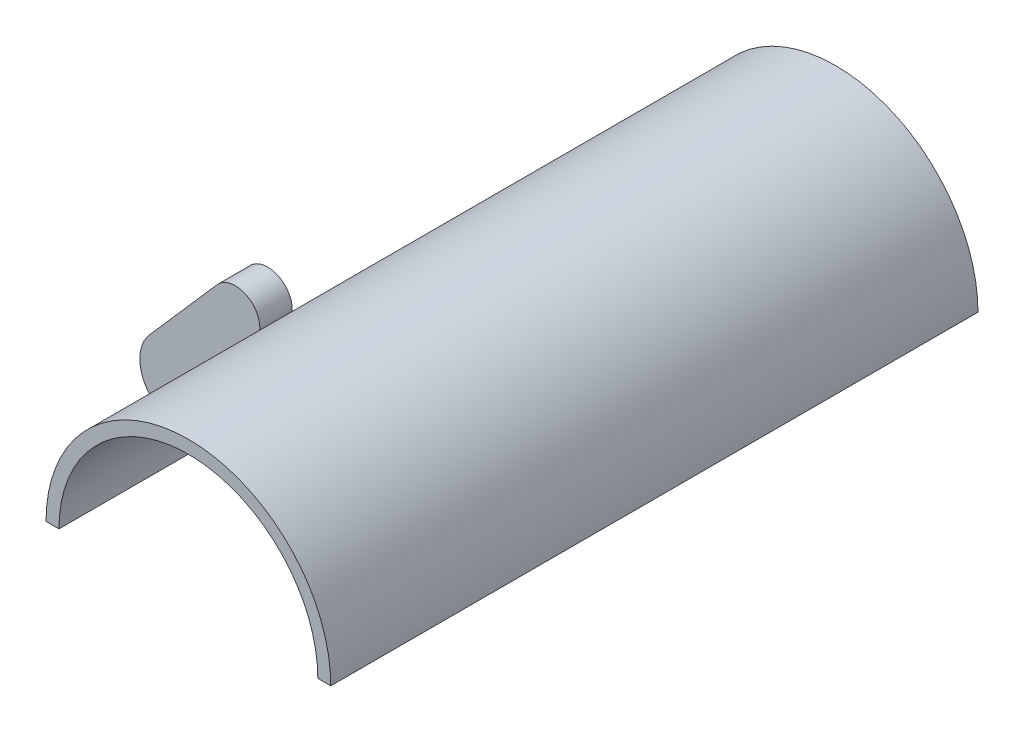
ISO-10303-21;
HEADER;
FILE_DESCRIPTION(('STEP AP214'),'2;1');
FILE_NAME('part.step','',(''),(''),'','','');
FILE_SCHEMA(('AUTOMOTIVE_DESIGN { 1 0 10303 214 1 1 1 1 }'));
ENDSEC;
DATA;
#1=APPLICATION_CONTEXT('core data for automotive mechanical design processes');
#2=APPLICATION_PROTOCOL_DEFINITION('international standard','automotive_design',2000,#1);
#3=PRODUCT_CONTEXT('',#1,'mechanical');
#4=PRODUCT('Part','Part','',(#3));
#5=PRODUCT_RELATED_PRODUCT_CATEGORY('part','',(#4));
#6=PRODUCT_DEFINITION_FORMATION('','',#4);
#7=PRODUCT_DEFINITION_CONTEXT('part definition',#1,'design');
#8=PRODUCT_DEFINITION('design','',#6,#7);
#9=PRODUCT_DEFINITION_SHAPE('','',#8);
#10=(LENGTH_UNIT() NAMED_UNIT(*) SI_UNIT(.MILLI.,.METRE.));
#11=(NAMED_UNIT(*) PLANE_ANGLE_UNIT() SI_UNIT($,.RADIAN.));
#12=(NAMED_UNIT(*) SI_UNIT($,.STERADIAN.) SOLID_ANGLE_UNIT());
#13=UNCERTAINTY_MEASURE_WITH_UNIT(LENGTH_MEASURE(1.E-05),#10,'distance_accuracy_value','');
#14=(GEOMETRIC_REPRESENTATION_CONTEXT(3) GLOBAL_UNCERTAINTY_ASSIGNED_CONTEXT((#13)) GLOBAL_UNIT_ASSIGNED_CONTEXT((#10,
#11,#12)) REPRESENTATION_CONTEXT('',''));
#15=CARTESIAN_POINT('',(0.,0.,0.));
#16=DIRECTION('',(0.,0.,1.));
#17=DIRECTION('',(1.,0.,0.));
#18=AXIS2_PLACEMENT_3D('',#15,#16,#17);
#19=CARTESIAN_POINT('',(0.,0.,50.));
#20=DIRECTION('',(0.,0.,-1.));
#21=DIRECTION('',(-1.,0.,0.));
#22=AXIS2_PLACEMENT_3D('',#19,#20,#21);
#23=CYLINDRICAL_SURFACE('',#22,22.);
#24=DIRECTION('',(0.,0.,1.));
#25=VECTOR('',#24,1.);
#26=CARTESIAN_POINT('',(-18.0543201260229,12.5714567488054,16.));
#27=LINE('',#26,#25);
#28=CARTESIAN_POINT('',(-18.0543201260229,12.5714567488054,16.));
#29=VERTEX_POINT('',#28);
#30=CARTESIAN_POINT('',(-18.0543201260229,12.5714567488054,21.));
#31=VERTEX_POINT('',#30);
#32=EDGE_CURVE('E198',#29,#31,#27,.T.);
#33=ORIENTED_EDGE('',*,*,#32,.T.);
#34=CARTESIAN_POINT('',(0.,0.,21.));
#35=DIRECTION('',(0.,0.,1.));
#36=DIRECTION('',(1.,0.,0.));
#37=AXIS2_PLACEMENT_3D('',#34,#35,#36);
#38=CIRCLE('',#37,22.);
#39=CARTESIAN_POINT('',(-22.,0.,21.));
#40=VERTEX_POINT('',#39);
#41=EDGE_CURVE('E293',#31,#40,#38,.T.);
#42=ORIENTED_EDGE('',*,*,#41,.T.);
#43=DIRECTION('',(0.,0.,-1.));
#44=VECTOR('',#43,1.);
#45=CARTESIAN_POINT('',(-22.,0.,50.));
#46=LINE('',#45,#44);
#47=CARTESIAN_POINT('',(-22.,0.,50.));
#48=VERTEX_POINT('',#47);
#49=EDGE_CURVE('E231',#48,#40,#46,.T.);
#50=ORIENTED_EDGE('',*,*,#49,.F.);
#51=CARTESIAN_POINT('',(0.,0.,50.));
#52=DIRECTION('',(0.,0.,1.));
#53=DIRECTION('',(1.,0.,0.));
#54=AXIS2_PLACEMENT_3D('',#51,#52,#53);
#55=CIRCLE('',#54,22.);
#56=CARTESIAN_POINT('',(22.,0.,50.));
#57=VERTEX_POINT('',#56);
#58=EDGE_CURVE('E216',#57,#48,#55,.T.);
#59=ORIENTED_EDGE('',*,*,#58,.F.);
#60=DIRECTION('',(0.,0.,-1.));
#61=VECTOR('',#60,1.);
#62=CARTESIAN_POINT('',(22.,0.,50.));
#63=LINE('',#62,#61);
#64=CARTESIAN_POINT('',(22.,0.,-50.));
#65=VERTEX_POINT('',#64);
#66=EDGE_CURVE('E46',#57,#65,#63,.T.);
#67=ORIENTED_EDGE('',*,*,#66,.T.);
#68=CARTESIAN_POINT('',(0.,0.,-50.));
#69=DIRECTION('',(0.,0.,1.));
#70=DIRECTION('',(1.,0.,0.));
#71=AXIS2_PLACEMENT_3D('',#68,#69,#70);
#72=CIRCLE('',#71,22.);
#73=CARTESIAN_POINT('',(-22.,0.,-50.));
#74=VERTEX_POINT('',#73);
#75=EDGE_CURVE('E222',#65,#74,#72,.T.);
#76=ORIENTED_EDGE('',*,*,#75,.T.);
#77=CARTESIAN_POINT('',(-22.,0.,-18.));
#78=VERTEX_POINT('',#77);
#79=EDGE_CURVE('E230',#78,#74,#46,.T.);
#80=ORIENTED_EDGE('',*,*,#79,.F.);
#81=CARTESIAN_POINT('',(0.,0.,-18.));
#82=DIRECTION('',(0.,0.,-1.));
#83=DIRECTION('',(-1.,0.,0.));
#84=AXIS2_PLACEMENT_3D('',#81,#82,#83);
#85=CIRCLE('',#84,22.);
#86=CARTESIAN_POINT('',(-19.9387713148063,9.29760175829542,-18.));
#87=VERTEX_POINT('',#86);
#88=EDGE_CURVE('E53',#78,#87,#85,.T.);
#89=ORIENTED_EDGE('',*,*,#88,.T.);
#90=DIRECTION('',(0.,0.,-1.));
#91=VECTOR('',#90,1.);
#92=CARTESIAN_POINT('',(-19.9387713148063,9.29760175829542,9.));
#93=LINE('',#92,#91);
#94=CARTESIAN_POINT('',(-19.9387713148063,9.29760175829542,9.));
#95=VERTEX_POINT('',#94);
#96=EDGE_CURVE('E267',#95,#87,#93,.T.);
#97=ORIENTED_EDGE('',*,*,#96,.F.);
#98=CARTESIAN_POINT('',(0.,0.,9.));
#99=DIRECTION('',(0.,0.,-1.));
#100=DIRECTION('',(-1.,0.,0.));
#101=AXIS2_PLACEMENT_3D('',#98,#99,#100);
#102=CIRCLE('',#101,22.);
#103=CARTESIAN_POINT('',(-22.,0.,9.));
#104=VERTEX_POINT('',#103);
#105=EDGE_CURVE('E261',#104,#95,#102,.T.);
#106=ORIENTED_EDGE('',*,*,#105,.F.);
#107=CARTESIAN_POINT('',(-22.,0.,16.));
#108=VERTEX_POINT('',#107);
#109=EDGE_CURVE('E232',#108,#104,#46,.T.);
#110=ORIENTED_EDGE('',*,*,#109,.F.);
#111=CARTESIAN_POINT('',(0.,0.,16.));
#112=DIRECTION('',(0.,0.,1.));
#113=DIRECTION('',(1.,0.,0.));
#114=AXIS2_PLACEMENT_3D('',#111,#112,#113);
#115=CIRCLE('',#114,22.);
#116=EDGE_CURVE('E302',#29,#108,#115,.T.);
#117=ORIENTED_EDGE('',*,*,#116,.F.);
#118=EDGE_LOOP('',(#33,#42,#50,#59,#67,#76,#80,#89,#97,#106,#110,#117));
#119=FACE_BOUND('',#118,.T.);
#120=ADVANCED_FACE('F38',(#119),#23,.T.);
#121=CARTESIAN_POINT('',(0.,0.,50.));
#122=DIRECTION('',(0.,0.,-1.));
#123=DIRECTION('',(-1.,0.,0.));
#124=AXIS2_PLACEMENT_3D('',#121,#122,#123);
#125=CYLINDRICAL_SURFACE('',#124,20.);
#126=CARTESIAN_POINT('',(0.,0.,9.));
#127=DIRECTION('',(0.,0.,1.));
#128=DIRECTION('',(-1.,0.,0.));
#129=AXIS2_PLACEMENT_3D('',#126,#127,#128);
#130=CIRCLE('',#129,20.);
#131=CARTESIAN_POINT('',(-18.126155740733,8.45236523481402,9.));
#132=VERTEX_POINT('',#131);
#133=CARTESIAN_POINT('',(-20.,0.,9.));
#134=VERTEX_POINT('',#133);
#135=EDGE_CURVE('E264',#132,#134,#130,.T.);
#136=ORIENTED_EDGE('',*,*,#135,.F.);
#137=DIRECTION('',(0.,0.,-1.));
#138=VECTOR('',#137,1.);
#139=CARTESIAN_POINT('',(-18.126155740733,8.45236523481402,9.));
#140=LINE('',#139,#138);
#141=CARTESIAN_POINT('',(-18.126155740733,8.45236523481402,-18.));
#142=VERTEX_POINT('',#141);
#143=EDGE_CURVE('E281',#132,#142,#140,.T.);
#144=ORIENTED_EDGE('',*,*,#143,.T.);
#145=CARTESIAN_POINT('',(0.,0.,-18.));
#146=DIRECTION('',(0.,0.,1.));
#147=DIRECTION('',(-1.,0.,0.));
#148=AXIS2_PLACEMENT_3D('',#145,#146,#147);
#149=CIRCLE('',#148,20.);
#150=CARTESIAN_POINT('',(-20.,0.,-18.));
#151=VERTEX_POINT('',#150);
#152=EDGE_CURVE('E273',#142,#151,#149,.T.);
#153=ORIENTED_EDGE('',*,*,#152,.T.);
#154=DIRECTION('',(0.,0.,-1.));
#155=VECTOR('',#154,1.);
#156=CARTESIAN_POINT('',(-20.,0.,50.));
#157=LINE('',#156,#155);
#158=CARTESIAN_POINT('',(-20.,0.,-50.));
#159=VERTEX_POINT('',#158);
#160=EDGE_CURVE('E219',#151,#159,#157,.T.);
#161=ORIENTED_EDGE('',*,*,#160,.T.);
#162=CARTESIAN_POINT('',(0.,0.,-50.));
#163=DIRECTION('',(0.,0.,-1.));
#164=DIRECTION('',(1.,0.,0.));
#165=AXIS2_PLACEMENT_3D('',#162,#163,#164);
#166=CIRCLE('',#165,20.);
#167=CARTESIAN_POINT('',(20.,0.,-50.));
#168=VERTEX_POINT('',#167);
#169=EDGE_CURVE('E187',#159,#168,#166,.T.);
#170=ORIENTED_EDGE('',*,*,#169,.T.);
#171=DIRECTION('',(0.,0.,-1.));
#172=VECTOR('',#171,1.);
#173=CARTESIAN_POINT('',(20.,0.,50.));
#174=LINE('',#173,#172);
#175=CARTESIAN_POINT('',(20.,0.,50.));
#176=VERTEX_POINT('',#175);
#177=EDGE_CURVE('E11',#176,#168,#174,.T.);
#178=ORIENTED_EDGE('',*,*,#177,.F.);
#179=CARTESIAN_POINT('',(0.,0.,50.));
#180=DIRECTION('',(0.,0.,-1.));
#181=DIRECTION('',(1.,0.,0.));
#182=AXIS2_PLACEMENT_3D('',#179,#180,#181);
#183=CIRCLE('',#182,20.);
#184=CARTESIAN_POINT('',(-20.,0.,50.));
#185=VERTEX_POINT('',#184);
#186=EDGE_CURVE('E210',#185,#176,#183,.T.);
#187=ORIENTED_EDGE('',*,*,#186,.F.);
#188=EDGE_CURVE('E227',#185,#134,#157,.T.);
#189=ORIENTED_EDGE('',*,*,#188,.T.);
#190=EDGE_LOOP('',(#136,#144,#153,#161,#170,#178,#187,#189));
#191=FACE_BOUND('',#190,.T.);
#192=ADVANCED_FACE('F40',(#191),#125,.F.);
#193=CARTESIAN_POINT('',(-22.,0.,50.));
#194=DIRECTION('',(0.,1.,0.));
#195=DIRECTION('',(0.,0.,1.));
#196=AXIS2_PLACEMENT_3D('',#193,#194,#195);
#197=PLANE('',#196);
#198=DIRECTION('',(-1.,0.,0.));
#199=VECTOR('',#198,1.);
#200=CARTESIAN_POINT('',(-20.,0.,9.));
#201=LINE('',#200,#199);
#202=EDGE_CURVE('E255',#134,#104,#201,.T.);
#203=ORIENTED_EDGE('',*,*,#202,.F.);
#204=ORIENTED_EDGE('',*,*,#188,.F.);
#205=DIRECTION('',(1.,0.,0.));
#206=VECTOR('',#205,1.);
#207=CARTESIAN_POINT('',(-22.,0.,50.));
#208=LINE('',#207,#206);
#209=EDGE_CURVE('E218',#48,#185,#208,.T.);
#210=ORIENTED_EDGE('',*,*,#209,.F.);
#211=ORIENTED_EDGE('',*,*,#49,.T.);
#212=DIRECTION('',(0.,0.,-1.));
#213=VECTOR('',#212,1.);
#214=CARTESIAN_POINT('',(-22.,0.,50.));
#215=LINE('',#214,#213);
#216=EDGE_CURVE('E181',#40,#108,#215,.T.);
#217=ORIENTED_EDGE('',*,*,#216,.T.);
#218=ORIENTED_EDGE('',*,*,#109,.T.);
#219=EDGE_LOOP('',(#203,#204,#210,#211,#217,#218));
#220=FACE_BOUND('',#219,.T.);
#221=ADVANCED_FACE('F253',(#220),#197,.F.);
#222=CARTESIAN_POINT('',(-21.7420628409897,13.3902403532748,16.));
#223=DIRECTION('',(0.,0.,1.));
#224=DIRECTION('',(1.,0.,0.));
#225=AXIS2_PLACEMENT_3D('',#222,#223,#224);
#226=CYLINDRICAL_SURFACE('',#225,2.5);
#227=CARTESIAN_POINT('',(-21.7420628409897,13.3902403532748,20.));
#228=DIRECTION('',(0.,0.,1.));
#229=DIRECTION('',(1.,0.,0.));
#230=AXIS2_PLACEMENT_3D('',#227,#228,#229);
#231=CIRCLE('',#230,2.5);
#232=CARTESIAN_POINT('',(-19.5307623307698,12.2239856411723,20.));
#233=VERTEX_POINT('',#232);
#234=CARTESIAN_POINT('',(-23.6967831610038,14.9487872632278,20.));
#235=VERTEX_POINT('',#234);
#236=EDGE_CURVE('E61',#233,#235,#231,.T.);
#237=ORIENTED_EDGE('',*,*,#236,.T.);
#238=DIRECTION('',(0.,0.,1.));
#239=VECTOR('',#238,1.);
#240=CARTESIAN_POINT('',(-23.6967831610038,14.9487872632278,16.));
#241=LINE('',#240,#239);
#242=CARTESIAN_POINT('',(-23.6967831610038,14.9487872632278,16.));
#243=VERTEX_POINT('',#242);
#244=EDGE_CURVE('E201',#243,#235,#241,.T.);
#245=ORIENTED_EDGE('',*,*,#244,.F.);
#246=CARTESIAN_POINT('',(-21.7420628409897,13.3902403532748,16.));
#247=DIRECTION('',(0.,0.,1.));
#248=DIRECTION('',(1.,0.,0.));
#249=AXIS2_PLACEMENT_3D('',#246,#247,#248);
#250=CIRCLE('',#249,2.5);
#251=CARTESIAN_POINT('',(-19.5307623307698,12.2239856411723,16.));
#252=VERTEX_POINT('',#251);
#253=EDGE_CURVE('E171',#252,#243,#250,.T.);
#254=ORIENTED_EDGE('',*,*,#253,.F.);
#255=DIRECTION('',(0.,0.,1.));
#256=VECTOR('',#255,1.);
#257=CARTESIAN_POINT('',(-19.5307623307698,12.2239856411723,16.));
#258=LINE('',#257,#256);
#259=EDGE_CURVE('E208',#252,#233,#258,.T.);
#260=ORIENTED_EDGE('',*,*,#259,.T.);
#261=EDGE_LOOP('',(#237,#245,#254,#260));
#262=FACE_BOUND('',#261,.T.);
#263=ADVANCED_FACE('F331',(#262),#226,.F.);
#264=CARTESIAN_POINT('',(-21.7736983758657,17.3607088310765,16.));
#265=DIRECTION('',(-0.781888128005642,0.623418763981189,0.));
#266=DIRECTION('',(-0.623418763981189,-0.781888128005642,0.));
#267=AXIS2_PLACEMENT_3D('',#264,#265,#266);
#268=PLANE('',#267);
#269=DIRECTION('',(-0.623418763981188,-0.781888128005642,0.));
#270=VECTOR('',#269,1.);
#271=CARTESIAN_POINT('',(-23.6967831610038,14.9487872632278,20.));
#272=LINE('',#271,#270);
#273=CARTESIAN_POINT('',(-33.6275525120226,2.49367505592476,20.));
#274=VERTEX_POINT('',#273);
#275=EDGE_CURVE('E286',#235,#274,#272,.T.);
#276=ORIENTED_EDGE('',*,*,#275,.T.);
#277=DIRECTION('',(0.,0.,1.));
#278=VECTOR('',#277,1.);
#279=CARTESIAN_POINT('',(-33.6275525120226,2.49367505592476,16.));
#280=LINE('',#279,#278);
#281=CARTESIAN_POINT('',(-33.6275525120226,2.49367505592476,16.));
#282=VERTEX_POINT('',#281);
#283=EDGE_CURVE('E203',#282,#274,#280,.T.);
#284=ORIENTED_EDGE('',*,*,#283,.F.);
#285=DIRECTION('',(-0.623418763981189,-0.781888128005642,0.));
#286=VECTOR('',#285,1.);
#287=CARTESIAN_POINT('',(-21.7736983758657,17.3607088310765,16.));
#288=LINE('',#287,#286);
#289=EDGE_CURVE('E300',#243,#282,#288,.T.);
#290=ORIENTED_EDGE('',*,*,#289,.F.);
#291=ORIENTED_EDGE('',*,*,#244,.T.);
#292=EDGE_LOOP('',(#276,#284,#290,#291));
#293=FACE_BOUND('',#292,.T.);
#294=ADVANCED_FACE('F334',(#293),#268,.F.);
#295=CARTESIAN_POINT('',(-30.5,0.,16.));
#296=DIRECTION('',(0.,0.,1.));
#297=DIRECTION('',(1.,0.,0.));
#298=AXIS2_PLACEMENT_3D('',#295,#296,#297);
#299=CYLINDRICAL_SURFACE('',#298,4.);
#300=CARTESIAN_POINT('',(-30.5,0.,20.));
#301=DIRECTION('',(0.,0.,1.));
#302=DIRECTION('',(1.,0.,0.));
#303=AXIS2_PLACEMENT_3D('',#300,#301,#302);
#304=CIRCLE('',#303,4.);
#305=CARTESIAN_POINT('',(-26.9619191836482,-1.86600753936413,20.));
#306=VERTEX_POINT('',#305);
#307=EDGE_CURVE('E288',#274,#306,#304,.T.);
#308=ORIENTED_EDGE('',*,*,#307,.T.);
#309=DIRECTION('',(0.,0.,1.));
#310=VECTOR('',#309,1.);
#311=CARTESIAN_POINT('',(-26.9619191836482,-1.86600753936413,16.));
#312=LINE('',#311,#310);
#313=CARTESIAN_POINT('',(-26.9619191836482,-1.86600753936413,16.));
#314=VERTEX_POINT('',#313);
#315=EDGE_CURVE('E206',#314,#306,#312,.T.);
#316=ORIENTED_EDGE('',*,*,#315,.F.);
#317=CARTESIAN_POINT('',(-30.5,0.,16.));
#318=DIRECTION('',(0.,0.,1.));
#319=DIRECTION('',(1.,0.,0.));
#320=AXIS2_PLACEMENT_3D('',#317,#318,#319);
#321=CIRCLE('',#320,4.);
#322=EDGE_CURVE('E298',#282,#314,#321,.T.);
#323=ORIENTED_EDGE('',*,*,#322,.F.);
#324=ORIENTED_EDGE('',*,*,#283,.T.);
#325=EDGE_LOOP('',(#308,#316,#323,#324));
#326=FACE_BOUND('',#325,.T.);
#327=ADVANCED_FACE('F341',(#326),#299,.F.);
#328=CARTESIAN_POINT('',(-20.3243869225611,10.7192179034392,16.));
#329=DIRECTION('',(0.884520204087937,-0.466501884841031,0.));
#330=DIRECTION('',(0.466501884841031,0.884520204087937,0.));
#331=AXIS2_PLACEMENT_3D('',#328,#329,#330);
#332=PLANE('',#331);
#333=DIRECTION('',(0.466501884841031,0.884520204087937,0.));
#334=VECTOR('',#333,1.);
#335=CARTESIAN_POINT('',(-26.9619191836482,-1.86600753936413,20.));
#336=LINE('',#335,#334);
#337=EDGE_CURVE('E291',#306,#233,#336,.T.);
#338=ORIENTED_EDGE('',*,*,#337,.T.);
#339=ORIENTED_EDGE('',*,*,#259,.F.);
#340=DIRECTION('',(0.466501884841031,0.884520204087937,0.));
#341=VECTOR('',#340,1.);
#342=CARTESIAN_POINT('',(-20.3243869225611,10.7192179034392,16.));
#343=LINE('',#342,#341);
#344=EDGE_CURVE('E296',#314,#252,#343,.T.);
#345=ORIENTED_EDGE('',*,*,#344,.F.);
#346=ORIENTED_EDGE('',*,*,#315,.T.);
#347=EDGE_LOOP('',(#338,#339,#345,#346));
#348=FACE_BOUND('',#347,.T.);
#349=ADVANCED_FACE('F344',(#348),#332,.F.);
#350=CARTESIAN_POINT('',(22.,0.,50.));
#351=DIRECTION('',(0.,1.,0.));
#352=DIRECTION('',(0.,0.,1.));
#353=AXIS2_PLACEMENT_3D('',#350,#351,#352);
#354=PLANE('',#353);
#355=DIRECTION('',(1.,0.,0.));
#356=VECTOR('',#355,1.);
#357=CARTESIAN_POINT('',(22.,0.,-50.));
#358=LINE('',#357,#356);
#359=EDGE_CURVE('E191',#168,#65,#358,.T.);
#360=ORIENTED_EDGE('',*,*,#359,.T.);
#361=ORIENTED_EDGE('',*,*,#66,.F.);
#362=DIRECTION('',(1.,0.,0.));
#363=VECTOR('',#362,1.);
#364=CARTESIAN_POINT('',(22.,0.,50.));
#365=LINE('',#364,#363);
#366=EDGE_CURVE('E213',#176,#57,#365,.T.);
#367=ORIENTED_EDGE('',*,*,#366,.F.);
#368=ORIENTED_EDGE('',*,*,#177,.T.);
#369=EDGE_LOOP('',(#360,#361,#367,#368));
#370=FACE_BOUND('',#369,.T.);
#371=ADVANCED_FACE('F346',(#370),#354,.F.);
#372=ORIENTED_EDGE('',*,*,#160,.F.);
#373=DIRECTION('',(-1.,0.,0.));
#374=VECTOR('',#373,1.);
#375=CARTESIAN_POINT('',(-20.,0.,-18.));
#376=LINE('',#375,#374);
#377=EDGE_CURVE('E248',#151,#78,#376,.T.);
#378=ORIENTED_EDGE('',*,*,#377,.T.);
#379=ORIENTED_EDGE('',*,*,#79,.T.);
#380=DIRECTION('',(1.,0.,0.));
#381=VECTOR('',#380,1.);
#382=CARTESIAN_POINT('',(-22.,0.,-50.));
#383=LINE('',#382,#381);
#384=EDGE_CURVE('E214',#74,#159,#383,.T.);
#385=ORIENTED_EDGE('',*,*,#384,.T.);
#386=EDGE_LOOP('',(#372,#378,#379,#385));
#387=FACE_BOUND('',#386,.T.);
#388=ADVANCED_FACE('F247',(#387),#197,.F.);
#389=CARTESIAN_POINT('',(0.,0.,50.));
#390=DIRECTION('',(0.,0.,1.));
#391=DIRECTION('',(1.,0.,0.));
#392=AXIS2_PLACEMENT_3D('',#389,#390,#391);
#393=PLANE('',#392);
#394=ORIENTED_EDGE('',*,*,#186,.T.);
#395=ORIENTED_EDGE('',*,*,#366,.T.);
#396=ORIENTED_EDGE('',*,*,#58,.T.);
#397=ORIENTED_EDGE('',*,*,#209,.T.);
#398=EDGE_LOOP('',(#394,#395,#396,#397));
#399=FACE_BOUND('',#398,.T.);
#400=ADVANCED_FACE('F363',(#399),#393,.T.);
#401=CARTESIAN_POINT('',(0.,0.,-50.));
#402=DIRECTION('',(0.,0.,1.));
#403=DIRECTION('',(1.,0.,0.));
#404=AXIS2_PLACEMENT_3D('',#401,#402,#403);
#405=PLANE('',#404);
#406=ORIENTED_EDGE('',*,*,#169,.F.);
#407=ORIENTED_EDGE('',*,*,#384,.F.);
#408=ORIENTED_EDGE('',*,*,#75,.F.);
#409=ORIENTED_EDGE('',*,*,#359,.F.);
#410=EDGE_LOOP('',(#406,#407,#408,#409));
#411=FACE_BOUND('',#410,.T.);
#412=ADVANCED_FACE('F244',(#411),#405,.F.);
#413=CARTESIAN_POINT('',(-30.5,0.,16.));
#414=DIRECTION('',(0.,0.,1.));
#415=DIRECTION('',(1.,0.,0.));
#416=AXIS2_PLACEMENT_3D('',#413,#414,#415);
#417=CYLINDRICAL_SURFACE('',#416,5.99999999999999);
#418=DIRECTION('',(0.,0.,1.));
#419=VECTOR('',#418,1.);
#420=CARTESIAN_POINT('',(-24.9918032786885,-2.37902687654711,16.));
#421=LINE('',#420,#419);
#422=CARTESIAN_POINT('',(-24.9918032786885,-2.37902687654711,16.));
#423=VERTEX_POINT('',#422);
#424=CARTESIAN_POINT('',(-24.9918032786885,-2.37902687654711,21.));
#425=VERTEX_POINT('',#424);
#426=EDGE_CURVE('E178',#423,#425,#421,.T.);
#427=ORIENTED_EDGE('',*,*,#426,.T.);
#428=CARTESIAN_POINT('',(-30.5,0.,21.));
#429=DIRECTION('',(0.,0.,1.));
#430=DIRECTION('',(1.,0.,0.));
#431=AXIS2_PLACEMENT_3D('',#428,#429,#430);
#432=CIRCLE('',#431,5.99999999999999);
#433=CARTESIAN_POINT('',(-35.0164727895182,3.94987006641251,21.));
#434=VERTEX_POINT('',#433);
#435=EDGE_CURVE('E161',#434,#425,#432,.T.);
#436=ORIENTED_EDGE('',*,*,#435,.F.);
#437=DIRECTION('',(0.,0.,1.));
#438=VECTOR('',#437,1.);
#439=CARTESIAN_POINT('',(-35.0164727895182,3.94987006641251,16.));
#440=LINE('',#439,#438);
#441=CARTESIAN_POINT('',(-35.0164727895182,3.94987006641251,16.));
#442=VERTEX_POINT('',#441);
#443=EDGE_CURVE('E188',#442,#434,#440,.T.);
#444=ORIENTED_EDGE('',*,*,#443,.F.);
#445=CARTESIAN_POINT('',(-30.5,0.,16.));
#446=DIRECTION('',(0.,0.,1.));
#447=DIRECTION('',(1.,0.,0.));
#448=AXIS2_PLACEMENT_3D('',#445,#446,#447);
#449=CIRCLE('',#448,5.99999999999999);
#450=EDGE_CURVE('E186',#442,#423,#449,.T.);
#451=ORIENTED_EDGE('',*,*,#450,.T.);
#452=EDGE_LOOP('',(#427,#436,#444,#451));
#453=FACE_BOUND('',#452,.T.);
#454=ADVANCED_FACE('F184',(#453),#417,.T.);
#455=CARTESIAN_POINT('',(-21.7985577057121,19.0638745289425,16.));
#456=DIRECTION('',(0.752745464919701,-0.658311677735419,0.));
#457=DIRECTION('',(0.658311677735419,0.752745464919701,0.));
#458=AXIS2_PLACEMENT_3D('',#455,#456,#457);
#459=PLANE('',#458);
#460=DIRECTION('',(0.658311677735419,0.752745464919701,0.));
#461=VECTOR('',#460,1.);
#462=CARTESIAN_POINT('',(-21.7985577057121,19.0638745289425,21.));
#463=LINE('',#462,#461);
#464=CARTESIAN_POINT('',(-24.5855933753918,15.8770429233759,21.));
#465=VERTEX_POINT('',#464);
#466=EDGE_CURVE('E168',#434,#465,#463,.T.);
#467=ORIENTED_EDGE('',*,*,#466,.T.);
#468=DIRECTION('',(0.,0.,1.));
#469=VECTOR('',#468,1.);
#470=CARTESIAN_POINT('',(-24.5855933753918,15.8770429233759,16.));
#471=LINE('',#470,#469);
#472=CARTESIAN_POINT('',(-24.5855933753918,15.8770429233759,16.));
#473=VERTEX_POINT('',#472);
#474=EDGE_CURVE('E193',#473,#465,#471,.T.);
#475=ORIENTED_EDGE('',*,*,#474,.F.);
#476=DIRECTION('',(0.658311677735419,0.752745464919701,0.));
#477=VECTOR('',#476,1.);
#478=CARTESIAN_POINT('',(-21.7985577057121,19.0638745289425,16.));
#479=LINE('',#478,#477);
#480=EDGE_CURVE('E307',#442,#473,#479,.T.);
#481=ORIENTED_EDGE('',*,*,#480,.F.);
#482=ORIENTED_EDGE('',*,*,#443,.T.);
#483=EDGE_LOOP('',(#467,#475,#481,#482));
#484=FACE_BOUND('',#483,.T.);
#485=ADVANCED_FACE('F314',(#484),#459,.F.);
#486=CARTESIAN_POINT('',(-21.7420628409897,13.3902403532748,16.));
#487=DIRECTION('',(0.,0.,1.));
#488=DIRECTION('',(1.,0.,0.));
#489=AXIS2_PLACEMENT_3D('',#486,#487,#488);
#490=CYLINDRICAL_SURFACE('',#489,3.77754588625188);
#491=CARTESIAN_POINT('',(-21.7420628409897,13.3902403532748,21.));
#492=DIRECTION('',(0.,0.,1.));
#493=DIRECTION('',(1.,0.,0.));
#494=AXIS2_PLACEMENT_3D('',#491,#492,#493);
#495=CIRCLE('',#494,3.77754588625188);
#496=EDGE_CURVE('E311',#31,#465,#495,.T.);
#497=ORIENTED_EDGE('',*,*,#496,.F.);
#498=ORIENTED_EDGE('',*,*,#32,.F.);
#499=CARTESIAN_POINT('',(-21.7420628409897,13.3902403532748,16.));
#500=DIRECTION('',(0.,0.,1.));
#501=DIRECTION('',(1.,0.,0.));
#502=AXIS2_PLACEMENT_3D('',#499,#500,#501);
#503=CIRCLE('',#502,3.77754588625188);
#504=EDGE_CURVE('E304',#29,#473,#503,.T.);
#505=ORIENTED_EDGE('',*,*,#504,.T.);
#506=ORIENTED_EDGE('',*,*,#474,.T.);
#507=EDGE_LOOP('',(#497,#498,#505,#506));
#508=FACE_BOUND('',#507,.T.);
#509=ADVANCED_FACE('F318',(#508),#490,.T.);
#510=CARTESIAN_POINT('',(0.,0.,16.));
#511=DIRECTION('',(0.,0.,1.));
#512=DIRECTION('',(1.,0.,0.));
#513=AXIS2_PLACEMENT_3D('',#510,#511,#512);
#514=PLANE('',#513);
#515=DIRECTION('',(0.78270512924009,0.622392706144002,0.));
#516=VECTOR('',#515,1.);
#517=CARTESIAN_POINT('',(-24.9918032786885,-2.37902687654711,16.));
#518=LINE('',#517,#516);
#519=EDGE_CURVE('E182',#423,#108,#518,.T.);
#520=ORIENTED_EDGE('',*,*,#519,.F.);
#521=ORIENTED_EDGE('',*,*,#450,.F.);
#522=ORIENTED_EDGE('',*,*,#480,.T.);
#523=ORIENTED_EDGE('',*,*,#504,.F.);
#524=ORIENTED_EDGE('',*,*,#116,.T.);
#525=EDGE_LOOP('',(#520,#521,#522,#523,#524));
#526=FACE_BOUND('',#525,.T.);
#527=ORIENTED_EDGE('',*,*,#253,.T.);
#528=ORIENTED_EDGE('',*,*,#289,.T.);
#529=ORIENTED_EDGE('',*,*,#322,.T.);
#530=ORIENTED_EDGE('',*,*,#344,.T.);
#531=EDGE_LOOP('',(#527,#528,#529,#530));
#532=FACE_BOUND('',#531,.T.);
#533=ADVANCED_FACE('F321',(#526,#532),#514,.F.);
#534=CARTESIAN_POINT('',(0.,0.,21.));
#535=DIRECTION('',(0.,0.,1.));
#536=DIRECTION('',(1.,0.,0.));
#537=AXIS2_PLACEMENT_3D('',#534,#535,#536);
#538=PLANE('',#537);
#539=ORIENTED_EDGE('',*,*,#435,.T.);
#540=DIRECTION('',(0.78270512924009,0.622392706144002,0.));
#541=VECTOR('',#540,1.);
#542=CARTESIAN_POINT('',(-24.9918032786885,-2.37902687654711,21.));
#543=LINE('',#542,#541);
#544=EDGE_CURVE('E164',#425,#40,#543,.T.);
#545=ORIENTED_EDGE('',*,*,#544,.T.);
#546=ORIENTED_EDGE('',*,*,#41,.F.);
#547=ORIENTED_EDGE('',*,*,#496,.T.);
#548=ORIENTED_EDGE('',*,*,#466,.F.);
#549=EDGE_LOOP('',(#539,#545,#546,#547,#548));
#550=FACE_BOUND('',#549,.T.);
#551=ADVANCED_FACE('F163',(#550),#538,.T.);
#552=CARTESIAN_POINT('',(-21.7420628409897,13.3902403532748,20.));
#553=DIRECTION('',(0.,0.,1.));
#554=DIRECTION('',(1.,0.,0.));
#555=AXIS2_PLACEMENT_3D('',#552,#553,#554);
#556=PLANE('',#555);
#557=ORIENTED_EDGE('',*,*,#236,.F.);
#558=ORIENTED_EDGE('',*,*,#337,.F.);
#559=ORIENTED_EDGE('',*,*,#307,.F.);
#560=ORIENTED_EDGE('',*,*,#275,.F.);
#561=EDGE_LOOP('',(#557,#558,#559,#560));
#562=FACE_BOUND('',#561,.T.);
#563=ADVANCED_FACE('F337',(#562),#556,.F.);
#564=CARTESIAN_POINT('',(-18.126155740733,8.45236523481402,9.));
#565=DIRECTION('',(0.422618261740701,0.906307787036649,0.));
#566=DIRECTION('',(-0.906307787036649,0.422618261740701,0.));
#567=AXIS2_PLACEMENT_3D('',#564,#565,#566);
#568=PLANE('',#567);
#569=DIRECTION('',(0.906307787036649,-0.422618261740701,0.));
#570=VECTOR('',#569,1.);
#571=CARTESIAN_POINT('',(-18.126155740733,8.45236523481402,-18.));
#572=LINE('',#571,#570);
#573=EDGE_CURVE('E278',#87,#142,#572,.T.);
#574=ORIENTED_EDGE('',*,*,#573,.T.);
#575=ORIENTED_EDGE('',*,*,#143,.F.);
#576=DIRECTION('',(0.906307787036649,-0.422618261740701,0.));
#577=VECTOR('',#576,1.);
#578=CARTESIAN_POINT('',(-18.126155740733,8.45236523481402,9.));
#579=LINE('',#578,#577);
#580=EDGE_CURVE('E268',#95,#132,#579,.T.);
#581=ORIENTED_EDGE('',*,*,#580,.F.);
#582=ORIENTED_EDGE('',*,*,#96,.T.);
#583=EDGE_LOOP('',(#574,#575,#581,#582));
#584=FACE_BOUND('',#583,.T.);
#585=ADVANCED_FACE('F406',(#584),#568,.F.);
#586=CARTESIAN_POINT('',(0.,0.,9.));
#587=DIRECTION('',(0.,0.,-1.));
#588=DIRECTION('',(-1.,0.,0.));
#589=AXIS2_PLACEMENT_3D('',#586,#587,#588);
#590=PLANE('',#589);
#591=ORIENTED_EDGE('',*,*,#135,.T.);
#592=ORIENTED_EDGE('',*,*,#202,.T.);
#593=ORIENTED_EDGE('',*,*,#105,.T.);
#594=ORIENTED_EDGE('',*,*,#580,.T.);
#595=EDGE_LOOP('',(#591,#592,#593,#594));
#596=FACE_BOUND('',#595,.T.);
#597=ADVANCED_FACE('F259',(#596),#590,.T.);
#598=CARTESIAN_POINT('',(0.,0.,-18.));
#599=DIRECTION('',(0.,0.,-1.));
#600=DIRECTION('',(-1.,0.,0.));
#601=AXIS2_PLACEMENT_3D('',#598,#599,#600);
#602=PLANE('',#601);
#603=ORIENTED_EDGE('',*,*,#152,.F.);
#604=ORIENTED_EDGE('',*,*,#573,.F.);
#605=ORIENTED_EDGE('',*,*,#88,.F.);
#606=ORIENTED_EDGE('',*,*,#377,.F.);
#607=EDGE_LOOP('',(#603,#604,#605,#606));
#608=FACE_BOUND('',#607,.T.);
#609=ADVANCED_FACE('F391',(#608),#602,.F.);
#610=CARTESIAN_POINT('',(-24.9918032786885,-2.37902687654711,18.5));
#611=DIRECTION('',(0.622392706144002,-0.78270512924009,0.));
#612=DIRECTION('',(0.78270512924009,0.622392706144002,0.));
#613=AXIS2_PLACEMENT_3D('',#610,#611,#612);
#614=PLANE('',#613);
#615=ORIENTED_EDGE('',*,*,#216,.F.);
#616=ORIENTED_EDGE('',*,*,#544,.F.);
#617=ORIENTED_EDGE('',*,*,#426,.F.);
#618=ORIENTED_EDGE('',*,*,#519,.T.);
#619=EDGE_LOOP('',(#615,#616,#617,#618));
#620=FACE_BOUND('',#619,.T.);
#621=ADVANCED_FACE('F176',(#620),#614,.T.);
#622=CLOSED_SHELL('',(#120,#192,#221,#263,#294,#327,#349,#371,#388,#400,#412,#454,#485,#509,
#533,#551,#563,#585,#597,#609,#621));
#623=MANIFOLD_SOLID_BREP('B2',#622);
#624=ADVANCED_BREP_SHAPE_REPRESENTATION('',(#18,#623),#14);
#625=SHAPE_DEFINITION_REPRESENTATION(#9,#624);
ENDSEC;
END-ISO-10303-21;
